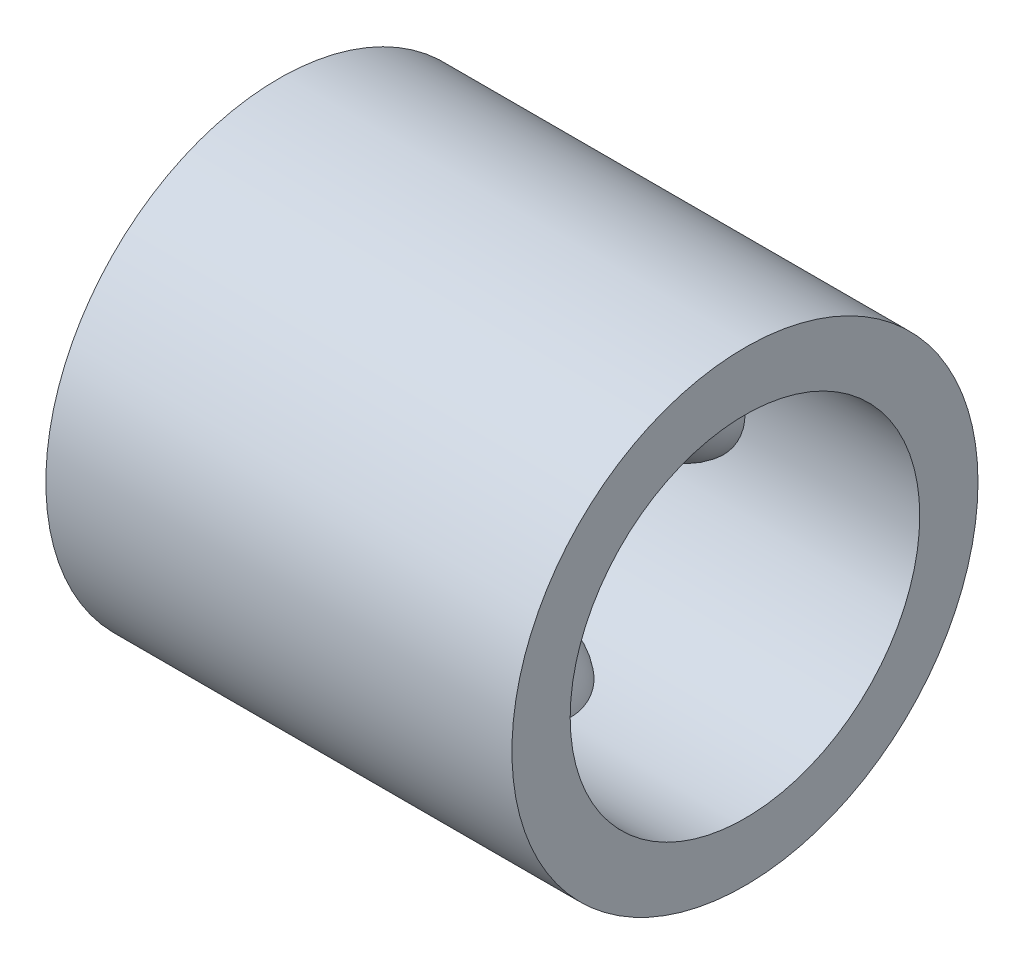
ISO-10303-21;
HEADER;
FILE_DESCRIPTION(('STEP AP214'),'2;1');
FILE_NAME('part.step','',(''),(''),'','','');
FILE_SCHEMA(('AUTOMOTIVE_DESIGN { 1 0 10303 214 1 1 1 1 }'));
ENDSEC;
DATA;
#1=APPLICATION_CONTEXT('core data for automotive mechanical design processes');
#2=APPLICATION_PROTOCOL_DEFINITION('international standard','automotive_design',2000,#1);
#3=PRODUCT_CONTEXT('',#1,'mechanical');
#4=PRODUCT('Part','Part','',(#3));
#5=PRODUCT_RELATED_PRODUCT_CATEGORY('part','',(#4));
#6=PRODUCT_DEFINITION_FORMATION('','',#4);
#7=PRODUCT_DEFINITION_CONTEXT('part definition',#1,'design');
#8=PRODUCT_DEFINITION('design','',#6,#7);
#9=PRODUCT_DEFINITION_SHAPE('','',#8);
#10=(LENGTH_UNIT() NAMED_UNIT(*) SI_UNIT(.MILLI.,.METRE.));
#11=(NAMED_UNIT(*) PLANE_ANGLE_UNIT() SI_UNIT($,.RADIAN.));
#12=(NAMED_UNIT(*) SI_UNIT($,.STERADIAN.) SOLID_ANGLE_UNIT());
#13=UNCERTAINTY_MEASURE_WITH_UNIT(LENGTH_MEASURE(1.E-05),#10,'distance_accuracy_value','');
#14=(GEOMETRIC_REPRESENTATION_CONTEXT(3) GLOBAL_UNCERTAINTY_ASSIGNED_CONTEXT((#13)) GLOBAL_UNIT_ASSIGNED_CONTEXT((#10,
#11,#12)) REPRESENTATION_CONTEXT('',''));
#15=CARTESIAN_POINT('',(0.,0.,0.));
#16=DIRECTION('',(0.,0.,1.));
#17=DIRECTION('',(1.,0.,0.));
#18=AXIS2_PLACEMENT_3D('',#15,#16,#17);
#19=CARTESIAN_POINT('',(3.,0.,0.));
#20=DIRECTION('',(-1.,0.,0.));
#21=DIRECTION('',(0.,0.,1.));
#22=AXIS2_PLACEMENT_3D('',#19,#20,#21);
#23=CYLINDRICAL_SURFACE('',#22,2.25);
#24=CARTESIAN_POINT('',(-0.514475453961807,2.18320390841012,-0.544169729315007));
#25=CARTESIAN_POINT('',(-0.483857231627168,2.1761902072911,-0.572310094441369));
#26=CARTESIAN_POINT('',(-0.450813327775773,2.16924991283592,-0.597833744538482));
#27=CARTESIAN_POINT('',(-0.380774390145702,2.15628679421965,-0.643025715138986));
#28=CARTESIAN_POINT('',(-0.343778953634256,2.15026406372702,-0.662693438042122));
#29=CARTESIAN_POINT('',(-0.266844975689494,2.13981010944048,-0.695711357899875));
#30=CARTESIAN_POINT('',(-0.226905638311693,2.13537931797646,-0.709059839022342));
#31=CARTESIAN_POINT('',(-0.145223717077277,2.12861619904622,-0.729113389079151));
#32=CARTESIAN_POINT('',(-0.103481307478905,2.12628366926657,-0.735819098512872));
#33=CARTESIAN_POINT('',(-0.0197141646853738,2.12399340156827,-0.742404435989499));
#34=CARTESIAN_POINT('',(0.0223060735039454,2.12401790787613,-0.74233510101298));
#35=CARTESIAN_POINT('',(0.1057305670577,2.12639448932343,-0.735499280158993));
#36=CARTESIAN_POINT('',(0.147134828336581,2.12874654209975,-0.728732858627332));
#37=CARTESIAN_POINT('',(0.227969113247706,2.13549627259527,-0.708706959526068));
#38=CARTESIAN_POINT('',(0.267407068336695,2.13988484443031,-0.69547637139618));
#39=CARTESIAN_POINT('',(0.343421166557742,2.15021709649336,-0.662840726508583));
#40=CARTESIAN_POINT('',(0.379997119418207,2.15616088000102,-0.643435259666465));
#41=CARTESIAN_POINT('',(0.449629769599129,2.16901329894139,-0.598687252225042));
#42=CARTESIAN_POINT('',(0.48265002859993,2.17593050422079,-0.573290451672591));
#43=CARTESIAN_POINT('',(0.543877718626474,2.18992285699697,-0.517271068549696));
#44=CARTESIAN_POINT('',(0.572084990068602,2.19699800972199,-0.486648312770231));
#45=CARTESIAN_POINT('',(0.622955896175885,2.21053726012287,-0.420893885574038));
#46=CARTESIAN_POINT('',(0.645610428947912,2.2170003440138,-0.385754953167662));
#47=CARTESIAN_POINT('',(0.684670902098911,2.22858158589341,-0.311956524235575));
#48=CARTESIAN_POINT('',(0.701077647244825,2.23369991707107,-0.273297481924685));
#49=CARTESIAN_POINT('',(0.7268821263319,2.24192710501993,-0.194424139022189));
#50=CARTESIAN_POINT('',(0.736421683028262,2.24507643419042,-0.154260491658911));
#51=CARTESIAN_POINT('',(0.748772387457628,2.24919120929505,-0.0728041449904459));
#52=CARTESIAN_POINT('',(0.751584590706671,2.25015699782355,-0.0315116238330233));
#53=CARTESIAN_POINT('',(0.750413559555535,2.24980526250114,0.0499669008304017));
#54=CARTESIAN_POINT('',(0.746592486531266,2.2485422138293,0.0901555850263528));
#55=CARTESIAN_POINT('',(0.732575819780321,2.24397286450379,0.16928279109688));
#56=CARTESIAN_POINT('',(0.722380358776834,2.24066660639245,0.208221338983201));
#57=CARTESIAN_POINT('',(0.695898711221334,2.23235691762788,0.283775158746051));
#58=CARTESIAN_POINT('',(0.679612028329649,2.22735334867336,0.320390241011872));
#59=CARTESIAN_POINT('',(0.641385127055321,2.21616577064354,0.390340254346888));
#60=CARTESIAN_POINT('',(0.619444261131622,2.20998162638478,0.4236748091115));
#61=CARTESIAN_POINT('',(0.569890423833992,2.19690961946458,0.486989887514105));
#62=CARTESIAN_POINT('',(0.542155020302811,2.19000852326509,0.516871848089479));
#63=CARTESIAN_POINT('',(0.482075887892009,2.17636144272173,0.571619457173987));
#64=CARTESIAN_POINT('',(0.449731554527286,2.16961547885926,0.596484446646162));
#65=CARTESIAN_POINT('',(0.380523740644164,2.15685802136129,0.641104897108603));
#66=CARTESIAN_POINT('',(0.343576946262503,2.15086580068845,0.660736819034802));
#67=CARTESIAN_POINT('',(0.266762204615628,2.1404644972055,0.693694529203856));
#68=CARTESIAN_POINT('',(0.226894274160553,2.13605540528588,0.707020353732855));
#69=CARTESIAN_POINT('',(0.145370073588033,2.12932213543557,0.727048833714005));
#70=CARTESIAN_POINT('',(0.103714365081812,2.12699730770693,0.73375355345261));
#71=CARTESIAN_POINT('',(0.0198039770435377,2.12469773678068,0.740386620773051));
#72=CARTESIAN_POINT('',(-0.0224506674294087,2.12472285659074,0.740315363366678));
#73=CARTESIAN_POINT('',(-0.105926569147837,2.12710796654301,0.733433144857918));
#74=CARTESIAN_POINT('',(-0.147153866444434,2.12944539359402,0.726687312972396));
#75=CARTESIAN_POINT('',(-0.227832370705416,2.13615780278291,0.706710529284008));
#76=CARTESIAN_POINT('',(-0.267283523246086,2.14053284730988,0.693479378908809));
#77=CARTESIAN_POINT('',(-0.343459051118068,2.15085209561958,0.660778817913344));
#78=CARTESIAN_POINT('',(-0.380173042792885,2.15680192025185,0.641287006865252));
#79=CARTESIAN_POINT('',(-0.44972387094788,2.16960563750987,0.596532707569719));
#80=CARTESIAN_POINT('',(-0.482560423479678,2.17645959626847,0.571269797096495));
#81=CARTESIAN_POINT('',(-0.543752182129761,2.19038372121967,0.515320959326244));
#82=CARTESIAN_POINT('',(-0.572064074543992,2.19745528396866,0.484587956184977));
#83=CARTESIAN_POINT('',(-0.623061383040388,2.21096660621594,0.418637618768502));
#84=CARTESIAN_POINT('',(-0.645747058314787,2.21740639481097,0.383420491184022));
#85=CARTESIAN_POINT('',(-0.68464844020338,2.22887308447836,0.309831964526335));
#86=CARTESIAN_POINT('',(-0.700927681512138,2.23391370593715,0.271496339352051));
#87=CARTESIAN_POINT('',(-0.726866713181036,2.24210545238323,0.192456778281599));
#88=CARTESIAN_POINT('',(-0.736527646244456,2.24525690353897,0.151753252539533));
#89=CARTESIAN_POINT('',(-0.748775461740738,2.24926105101613,0.0703043175939487));
#90=CARTESIAN_POINT('',(-0.751544807378986,2.25017303118791,0.0295892039111422));
#91=CARTESIAN_POINT('',(-0.75046112809102,2.24977245288563,-0.0517396092072579));
#92=CARTESIAN_POINT('',(-0.746608709272761,2.24846009801111,-0.0923533175839922));
#93=CARTESIAN_POINT('',(-0.73249574084281,2.24378415669825,-0.171733480479104));
#94=CARTESIAN_POINT('',(-0.722325966840066,2.24044964300326,-0.210517869596279));
#95=CARTESIAN_POINT('',(-0.695942650492098,2.23209895941017,-0.28577740475182));
#96=CARTESIAN_POINT('',(-0.679728987612475,2.22708275597402,-0.322252504718631));
#97=CARTESIAN_POINT('',(-0.641610778415956,2.21585687169717,-0.392091598761657));
#98=CARTESIAN_POINT('',(-0.619682860149768,2.20964231726382,-0.425442032650324));
#99=CARTESIAN_POINT('',(-0.570732820152052,2.19666423391209,-0.488047199953124));
#100=CARTESIAN_POINT('',(-0.543709821623349,2.18990061062034,-0.517301226916571));
#101=CARTESIAN_POINT('',(-0.514475453961807,2.18320390841012,-0.544169729315007));
#102=B_SPLINE_CURVE_WITH_KNOTS('',3,(#24,#25,#26,#27,#28,#29,#30,#31,#32,#33,#34,#35,#36,#37,
#38,#39,#40,#41,#42,#43,#44,#45,#46,#47,#48,#49,#50,#51,#52,#53,#54,#55,#56,#57,#58,#59,#60,#61,
#62,#63,#64,#65,#66,#67,#68,#69,#70,#71,#72,#73,#74,#75,#76,#77,#78,#79,#80,#81,#82,#83,#84,#85,
#86,#87,#88,#89,#90,#91,#92,#93,#94,#95,#96,#97,#98,#99,#100,#101),.UNSPECIFIED.,.T.,.F.,(4,2,2,
2,2,2,2,2,2,2,2,2,2,2,2,2,2,2,2,2,2,2,2,2,2,2,2,2,2,2,2,2,2,2,2,2,2,2,4),(0.,0.126375294112325,
0.252763480468869,0.379185964723026,0.505596258071001,0.631054365982607,0.756511268500674,
0.881412542229377,1.00632211260021,1.13240955727877,1.25850118181058,1.38479813032264,
1.51107880523151,1.63467021422507,1.7582422305594,1.87883570328985,1.99942666518831,
2.12002745551276,2.24064206369474,2.3641237614439,2.48762166939136,2.61381850014852,
2.74001460474311,2.86617135227577,2.99232074538983,3.11725121668004,3.24218551342385,
3.36757189561395,3.49296745427537,3.61949952559111,3.74602576666175,3.87126352024763,
3.99647964509103,4.1183434628539,4.24019612668693,4.36033711786141,4.48048050515819,
4.60112322319687,4.7217867212614),.UNSPECIFIED.);
#103=CARTESIAN_POINT('',(-0.514475453961807,2.18320390841012,-0.544169729315007));
#104=VERTEX_POINT('',#103);
#105=EDGE_CURVE('E47',#104,#104,#102,.T.);
#106=ORIENTED_EDGE('',*,*,#105,.F.);
#107=EDGE_LOOP('',(#106));
#108=FACE_BOUND('',#107,.T.);
#109=CARTESIAN_POINT('',(0.,0.739509972887508,-2.125));
#110=CARTESIAN_POINT('',(-0.0418371706315381,0.739509966019105,-2.12500000431577));
#111=CARTESIAN_POINT('',(-0.0836743875340047,0.736150146359343,-2.1261781814544));
#112=CARTESIAN_POINT('',(-0.166149676344008,0.722790287096492,-2.13075649219653));
#113=CARTESIAN_POINT('',(-0.206787700874341,0.712789985509806,-2.13415671346513));
#114=CARTESIAN_POINT('',(-0.285700392840389,0.686389739853428,-2.14279267803087));
#115=CARTESIAN_POINT('',(-0.323976057723693,0.66999251843164,-2.14802764033194));
#116=CARTESIAN_POINT('',(-0.397134833056352,0.631179929985015,-2.15975023940309));
#117=CARTESIAN_POINT('',(-0.432017733770347,0.608764191226587,-2.1662379535424));
#118=CARTESIAN_POINT('',(-0.497678783619839,0.558266206938434,-2.17979932833351));
#119=CARTESIAN_POINT('',(-0.528426708185485,0.530145648371433,-2.18687674919534));
#120=CARTESIAN_POINT('',(-0.584690944410479,0.469029554180578,-2.20079335185671));
#121=CARTESIAN_POINT('',(-0.610207312787381,0.436034071414551,-2.20763253623841));
#122=CARTESIAN_POINT('',(-0.655208568424211,0.366167341410911,-2.22028717022817));
#123=CARTESIAN_POINT('',(-0.674716916540663,0.329311942824073,-2.22610656263945));
#124=CARTESIAN_POINT('',(-0.707274528363552,0.252643083046293,-2.23610458756606));
#125=CARTESIAN_POINT('',(-0.720324795547407,0.212830082523476,-2.24028347496748));
#126=CARTESIAN_POINT('',(-0.739338019835766,0.132437324513902,-2.24645158079142));
#127=CARTESIAN_POINT('',(-0.745469493174582,0.0919014007760092,-2.24849277211633));
#128=CARTESIAN_POINT('',(-0.751042664384464,0.0103239324949375,-2.25034596487959));
#129=CARTESIAN_POINT('',(-0.750485240568959,-0.0307175449574183,-2.2501582589926));
#130=CARTESIAN_POINT('',(-0.742777019983859,-0.111280489325454,-2.24760086789779));
#131=CARTESIAN_POINT('',(-0.735757088026058,-0.150815960989175,-2.24527449173513));
#132=CARTESIAN_POINT('',(-0.715507422410703,-0.228098175622725,-2.23874425011262));
#133=CARTESIAN_POINT('',(-0.702277576804338,-0.265844886332276,-2.23454035080592));
#134=CARTESIAN_POINT('',(-0.669849639557223,-0.3388052128744,-2.22465221609146));
#135=CARTESIAN_POINT('',(-0.650608416685397,-0.373998182341165,-2.21895733239637));
#136=CARTESIAN_POINT('',(-0.606700107500377,-0.440647099811357,-2.20668985928605));
#137=CARTESIAN_POINT('',(-0.582032291612844,-0.47210254444937,-2.20011715189918));
#138=CARTESIAN_POINT('',(-0.527192264550854,-0.531285252553719,-2.18659159372553));
#139=CARTESIAN_POINT('',(-0.496893126732277,-0.558893698799539,-2.17963329801266));
#140=CARTESIAN_POINT('',(-0.432042573374848,-0.608721624588851,-2.16624687270803));
#141=CARTESIAN_POINT('',(-0.397490707833847,-0.630940533098443,-2.15981879934213));
#142=CARTESIAN_POINT('',(-0.32442687188633,-0.6698038108282,-2.14808838776009));
#143=CARTESIAN_POINT('',(-0.285857378082089,-0.686346565946613,-2.14280713516123));
#144=CARTESIAN_POINT('',(-0.206340262500953,-0.712930295108097,-2.13411047795531));
#145=CARTESIAN_POINT('',(-0.165392730295547,-0.722971513865985,-2.13069500312199));
#146=CARTESIAN_POINT('',(-0.0825037269152612,-0.736279939551203,-2.12613306358538));
#147=CARTESIAN_POINT('',(-0.0405684431727888,-0.739581684378479,-2.12497503150767));
#148=CARTESIAN_POINT('',(0.0432876641862948,-0.739435902271017,-2.12502579001178));
#149=CARTESIAN_POINT('',(0.0852084883378776,-0.735988659800096,-2.12623448083834));
#150=CARTESIAN_POINT('',(0.167509637061314,-0.722480203607325,-2.13086178222927));
#151=CARTESIAN_POINT('',(0.207899334338746,-0.712470094623093,-2.13426331384963));
#152=CARTESIAN_POINT('',(0.286352678807986,-0.686118340470936,-2.14287946980289));
#153=CARTESIAN_POINT('',(0.324416204648952,-0.669776365310447,-2.1480941886307));
#154=CARTESIAN_POINT('',(0.397441353115855,-0.630999716351527,-2.1598033938536));
#155=CARTESIAN_POINT('',(0.43237894935124,-0.608522472923302,-2.16630673155244));
#156=CARTESIAN_POINT('',(0.497902539145396,-0.55805759191544,-2.17985145165143));
#157=CARTESIAN_POINT('',(0.528488274733964,-0.530069627904771,-2.18689286590977));
#158=CARTESIAN_POINT('',(0.584654658525143,-0.469078145270145,-2.20078348265165));
#159=CARTESIAN_POINT('',(0.61020326891299,-0.436044753034304,-2.20763123154135));
#160=CARTESIAN_POINT('',(0.655341941546338,-0.365955866909575,-2.22032484398499));
#161=CARTESIAN_POINT('',(0.674932538649352,-0.328900734462269,-2.22617079745065));
#162=CARTESIAN_POINT('',(0.707324539809624,-0.252428766319439,-2.23612193609591));
#163=CARTESIAN_POINT('',(0.72023036666753,-0.21305967164359,-2.24025368144153));
#164=CARTESIAN_POINT('',(0.739345418462079,-0.132572826587885,-2.24645314839796));
#165=CARTESIAN_POINT('',(0.745555789005848,-0.0914553766072623,-2.2485212231028));
#166=CARTESIAN_POINT('',(0.751022308512595,-0.00980606783013249,-2.25033944166939));
#167=CARTESIAN_POINT('',(0.750457959234294,0.0307125361917834,-2.25014941710174));
#168=CARTESIAN_POINT('',(0.742825404044873,0.111061265620046,-2.24761671611889));
#169=CARTESIAN_POINT('',(0.735757587568383,0.150891432105282,-2.24527416859911));
#170=CARTESIAN_POINT('',(0.715394933362594,0.228449952835044,-2.2387084556585));
#171=CARTESIAN_POINT('',(0.702145360931979,0.266191390866625,-2.23449897158901));
#172=CARTESIAN_POINT('',(0.66979748174088,0.338873068769509,-2.22463737979475));
#173=CARTESIAN_POINT('',(0.650698668322434,0.373813065650614,-2.21898514710695));
#174=CARTESIAN_POINT('',(0.60672293979902,0.440660916019108,-2.20669362800509));
#175=CARTESIAN_POINT('',(0.581740003658554,0.472495823063799,-2.20003715037846));
#176=CARTESIAN_POINT('',(0.526864814769053,0.53155887263607,-2.18651892123088));
#177=CARTESIAN_POINT('',(0.496971831017608,0.558786327984105,-2.17965713926903));
#178=CARTESIAN_POINT('',(0.432239749482909,0.608617408819048,-2.16627993006041));
#179=CARTESIAN_POINT('',(0.397295421794057,0.631087969788498,-2.15977750233819));
#180=CARTESIAN_POINT('',(0.323998163577887,0.669987537906863,-2.14802965741675));
#181=CARTESIAN_POINT('',(0.285645211824527,0.686416507430557,-2.14278424804593));
#182=CARTESIAN_POINT('',(0.206670956338058,0.712820724653085,-2.13414632927724));
#183=CARTESIAN_POINT('',(0.166054657590748,0.722809642648206,-2.13074989745758));
#184=CARTESIAN_POINT('',(0.083625543998036,0.736154087729182,-2.12617679172238));
#185=CARTESIAN_POINT('',(0.0418127951075313,0.739509979751909,-2.12499999568674));
#186=CARTESIAN_POINT('',(0.,0.739509972887508,-2.125));
#187=B_SPLINE_CURVE_WITH_KNOTS('',3,(#109,#110,#111,#112,#113,#114,#115,#116,#117,#118,#119,
#120,#121,#122,#123,#124,#125,#126,#127,#128,#129,#130,#131,#132,#133,#134,#135,#136,#137,#138,
#139,#140,#141,#142,#143,#144,#145,#146,#147,#148,#149,#150,#151,#152,#153,#154,#155,#156,#157,
#158,#159,#160,#161,#162,#163,#164,#165,#166,#167,#168,#169,#170,#171,#172,#173,#174,#175,#176,
#177,#178,#179,#180,#181,#182,#183,#184,#185,#186),.UNSPECIFIED.,.T.,.F.,(4,2,2,2,2,2,2,2,2,2,2,
2,2,2,2,2,2,2,2,2,2,2,2,2,2,2,2,2,2,2,2,2,2,2,2,2,2,2,4),(0.,0.1253619905,0.250728927137501,
0.376042563389552,0.501363941416855,0.627556620169112,0.75374793073986,0.879440036132522,
1.00511260494373,1.12765332027824,1.25017794507114,1.37027477659391,1.49037377323759,
1.61135506760032,1.73235263715618,1.85651013413786,1.98068078015109,2.10697067522035,
2.23325581652009,2.35889214062404,2.4845231693826,2.60918735229326,2.73385803309675,
2.85941675342061,2.98498291353374,3.11132363163133,3.23765300463131,3.36194447684625,
3.48621467914346,3.60719967156724,3.72817741975061,3.84828289808141,3.96839878282494,
4.09087150035042,4.21336246803176,4.33892494924725,4.46448821241502,4.58978405719696,
4.71507300824036),.UNSPECIFIED.);
#188=CARTESIAN_POINT('',(0.,0.739509972887508,-2.125));
#189=VERTEX_POINT('',#188);
#190=EDGE_CURVE('E80',#189,#189,#187,.T.);
#191=ORIENTED_EDGE('',*,*,#190,.F.);
#192=EDGE_LOOP('',(#191));
#193=FACE_BOUND('',#192,.T.);
#194=CARTESIAN_POINT('',(3.,0.,0.));
#195=DIRECTION('',(1.,0.,0.));
#196=DIRECTION('',(0.,0.,-1.));
#197=AXIS2_PLACEMENT_3D('',#194,#195,#196);
#198=CIRCLE('',#197,2.25);
#199=CARTESIAN_POINT('',(3.,0.,-2.25));
#200=VERTEX_POINT('',#199);
#201=EDGE_CURVE('E123',#200,#200,#198,.T.);
#202=ORIENTED_EDGE('',*,*,#201,.T.);
#203=EDGE_LOOP('',(#202));
#204=FACE_BOUND('',#203,.T.);
#205=CARTESIAN_POINT('',(-3.,0.,0.));
#206=DIRECTION('',(1.,0.,0.));
#207=DIRECTION('',(0.,0.,-1.));
#208=AXIS2_PLACEMENT_3D('',#205,#206,#207);
#209=CIRCLE('',#208,2.25);
#210=CARTESIAN_POINT('',(-3.,0.,-2.25));
#211=VERTEX_POINT('',#210);
#212=EDGE_CURVE('E120',#211,#211,#209,.T.);
#213=ORIENTED_EDGE('',*,*,#212,.F.);
#214=EDGE_LOOP('',(#213));
#215=FACE_BOUND('',#214,.T.);
#216=DIRECTION('',(-1.,0.,0.));
#217=VECTOR('',#216,1.);
#218=CARTESIAN_POINT('',(3.,0.0734586080407039,2.2488005320403));
#219=LINE('',#218,#217);
#220=CARTESIAN_POINT('',(-0.747357423599524,0.0734586080407038,2.24880053204029));
#221=VERTEX_POINT('',#220);
#222=CARTESIAN_POINT('',(0.747357423599524,0.0734586080407038,2.24880053204029));
#223=VERTEX_POINT('',#222);
#224=EDGE_CURVE('E112',#221,#223,#219,.F.);
#225=ORIENTED_EDGE('',*,*,#224,.T.);
#226=CARTESIAN_POINT('',(-0.514398684503027,-0.543051733531788,2.18348226800863));
#227=CARTESIAN_POINT('',(-0.483783185887388,-0.571192955005356,2.1764836562346));
#228=CARTESIAN_POINT('',(-0.450742091667321,-0.596717547068843,2.16955719325324));
#229=CARTESIAN_POINT('',(-0.380708976034091,-0.64191114696204,2.1566188273322));
#230=CARTESIAN_POINT('',(-0.343716548577389,-0.66157955221519,2.15060701853764));
#231=CARTESIAN_POINT('',(-0.266788852834119,-0.694598209138778,2.14017168474279));
#232=CARTESIAN_POINT('',(-0.226852789396475,-0.707946746370001,2.13574859080386));
#233=CARTESIAN_POINT('',(-0.145177716627632,-0.727999530986332,2.12899739128722));
#234=CARTESIAN_POINT('',(-0.103438882081227,-0.734704420993333,2.1266690830886));
#235=CARTESIAN_POINT('',(-0.0196813752052072,-0.74128697634497,2.12438365615237));
#236=CARTESIAN_POINT('',(0.0223327736354555,-0.741216037431114,2.12440868694097));
#237=CARTESIAN_POINT('',(0.105744892028978,-0.734376787364873,2.12678241907275));
#238=CARTESIAN_POINT('',(0.147142867560311,-0.727608541236731,2.12913109785559));
#239=CARTESIAN_POINT('',(0.227964692602254,-0.707578914450053,2.13587030666006));
#240=CARTESIAN_POINT('',(0.267396469570934,-0.694346408826828,2.14025175223145));
#241=CARTESIAN_POINT('',(0.343398366486493,-0.66170708924228,2.15056622483903));
#242=CARTESIAN_POINT('',(0.37996829610715,-0.642299865067366,2.15649935495576));
#243=CARTESIAN_POINT('',(0.449589120339642,-0.597548828657383,2.16932718218161));
#244=CARTESIAN_POINT('',(0.482603583166405,-0.572150766393174,2.17623041831714));
#245=CARTESIAN_POINT('',(0.543820144262242,-0.516129713097277,2.19019209891658));
#246=CARTESIAN_POINT('',(0.572022083107632,-0.485506549041689,2.19725054851347));
#247=CARTESIAN_POINT('',(0.622882842679325,-0.41975257993329,2.21075420489947));
#248=CARTESIAN_POINT('',(0.645532576957213,-0.384614527377647,2.21719839603232));
#249=CARTESIAN_POINT('',(0.684584203728644,-0.310819339491882,2.22874039549734));
#250=CARTESIAN_POINT('',(0.7009869008697,-0.272162658172807,2.23383837720161));
#251=CARTESIAN_POINT('',(0.72678426852694,-0.193295489564008,2.24202460862378));
#252=CARTESIAN_POINT('',(0.736320725250111,-0.153135614669883,2.24515334050691));
#253=CARTESIAN_POINT('',(0.748666133844661,-0.0716883668322173,2.24922694801321));
#254=CARTESIAN_POINT('',(0.751476140685263,-0.0304011717238579,2.25017216609555));
#255=CARTESIAN_POINT('',(0.750301744324097,0.0510658453441903,2.24978049052408));
#256=CARTESIAN_POINT('',(0.746479414547634,0.0912483802520188,2.24849803341119));
#257=CARTESIAN_POINT('',(0.732461110028677,0.170362199782374,2.24389107534484));
#258=CARTESIAN_POINT('',(0.722265267570539,0.209293510356841,2.24056661677382));
#259=CARTESIAN_POINT('',(0.695783625346983,0.284832503162056,2.23222216462521));
#260=CARTESIAN_POINT('',(0.679497267966375,0.321439972275139,2.22720201580329));
#261=CARTESIAN_POINT('',(0.641271798629209,0.39137436994814,2.21598329591716));
#262=CARTESIAN_POINT('',(0.619332039054824,0.424700922062176,2.20978458986625));
#263=CARTESIAN_POINT('',(0.569781169398389,0.487999871195755,2.19668541505582));
#264=CARTESIAN_POINT('',(0.542047638201379,0.517873700028746,2.18977176692232));
#265=CARTESIAN_POINT('',(0.481972976551979,0.572605478257279,2.17610216199842));
#266=CARTESIAN_POINT('',(0.449631241921067,0.597462768903537,2.16934622602095));
#267=CARTESIAN_POINT('',(0.3804297607368,0.64206820837253,2.15657139777011));
#268=CARTESIAN_POINT('',(0.343486760232944,0.661692902780104,2.15057182737934));
#269=CARTESIAN_POINT('',(0.266680307210533,0.694637469600555,2.14015863766638));
#270=CARTESIAN_POINT('',(0.226816871832339,0.7079573790135,2.13574500903704));
#271=CARTESIAN_POINT('',(0.145302968385111,0.727975422647171,2.12900550985056));
#272=CARTESIAN_POINT('',(0.103653092293998,0.734675733002948,2.12667895321));
#273=CARTESIAN_POINT('',(0.0197548963698151,0.74130193240624,2.12437855472849));
#274=CARTESIAN_POINT('',(-0.0224933884026181,0.74122821671437,2.12440457561596));
#275=CARTESIAN_POINT('',(-0.10595594860769,0.734343131722615,2.12679398593542));
#276=CARTESIAN_POINT('',(-0.147176272368036,0.727596923918305,2.12913477006277));
#277=CARTESIAN_POINT('',(-0.227840697060373,0.707621410254324,2.13585624239905));
#278=CARTESIAN_POINT('',(-0.267284743521205,0.694391905726083,2.14023699311877));
#279=CARTESIAN_POINT('',(-0.343446335460178,0.661696418946021,2.15056997617571));
#280=CARTESIAN_POINT('',(-0.380153482222916,0.642208009768351,2.15652784594769));
#281=CARTESIAN_POINT('',(-0.449690913795552,0.597462063955714,2.16934988112844));
#282=CARTESIAN_POINT('',(-0.482520914471723,0.572204104901134,2.17621411288129));
#283=CARTESIAN_POINT('',(-0.543700339614976,0.516266137258691,2.19016110730748));
#284=CARTESIAN_POINT('',(-0.572006405428777,0.485539009877184,2.19724528772402));
#285=CARTESIAN_POINT('',(-0.622992665405154,0.419601147320961,2.21078389740338));
#286=CARTESIAN_POINT('',(-0.645673118444704,0.384390618574322,2.21723835563618));
#287=CARTESIAN_POINT('',(-0.684565032964776,0.310815201432528,2.22873612054069));
#288=CARTESIAN_POINT('',(-0.70083996833885,0.272486054031543,2.23379311745096));
#289=CARTESIAN_POINT('',(-0.726771135623141,0.193459304636151,2.24201909082461));
#290=CARTESIAN_POINT('',(-0.736428510017562,0.152762112788046,2.24518839317534));
#291=CARTESIAN_POINT('',(-0.748670151846211,0.0713250145203232,2.24922882899027));
#292=CARTESIAN_POINT('',(-0.751436827850201,0.030615410514898,2.25015920745907));
#293=CARTESIAN_POINT('',(-0.750348579846343,-0.0507030383859321,2.24979595757257));
#294=CARTESIAN_POINT('',(-0.746494261012957,-0.0913118921503983,2.24850253247812));
#295=CARTESIAN_POINT('',(-0.732378310388303,-0.170683206660808,2.24386419887035));
#296=CARTESIAN_POINT('',(-0.722207434395441,-0.209463589929355,2.24054836011606));
#297=CARTESIAN_POINT('',(-0.695822705267512,-0.284715803564501,2.23223452387639));
#298=CARTESIAN_POINT('',(-0.679608735455079,-0.321187589341821,2.22723649391218));
#299=CARTESIAN_POINT('',(-0.641494854974584,-0.391013084454263,2.21604722770341));
#300=CARTESIAN_POINT('',(-0.619572795268578,-0.424353943540432,2.20985136820168));
#301=CARTESIAN_POINT('',(-0.570637362876661,-0.486942333212404,2.19690924442415));
#302=CARTESIAN_POINT('',(-0.543623114110937,-0.51618915793373,2.19016288555175));
#303=CARTESIAN_POINT('',(-0.514398684503027,-0.543051733531788,2.18348226800863));
#304=B_SPLINE_CURVE_WITH_KNOTS('',3,(#226,#227,#228,#229,#230,#231,#232,#233,#234,#235,#236,
#237,#238,#239,#240,#241,#242,#243,#244,#245,#246,#247,#248,#249,#250,#251,#252,#253,#254,#255,
#256,#257,#258,#259,#260,#261,#262,#263,#264,#265,#266,#267,#268,#269,#270,#271,#272,#273,#274,
#275,#276,#277,#278,#279,#280,#281,#282,#283,#284,#285,#286,#287,#288,#289,#290,#291,#292,#293,
#294,#295,#296,#297,#298,#299,#300,#301,#302,#303),.UNSPECIFIED.,.T.,.F.,(4,2,2,2,2,2,2,2,2,2,2,
2,2,2,2,2,2,2,2,2,2,2,2,2,2,2,2,2,2,2,2,2,2,2,2,2,2,2,4),(0.,0.126363588208219,
0.252740174199076,0.379151023722808,0.505549644675549,0.6309895886639,0.756428314766141,
0.881311775647686,1.00620353481732,1.13227288403076,1.2583464087122,1.38462490155727,
1.51088712363831,1.6344608213065,1.75801513653755,1.87859253080836,1.99916742253872,
2.11975335616933,2.24035310950385,2.3638197628844,2.48730261881746,2.61348262313116,
2.73966188693953,2.86579965660681,2.99193006621076,3.11684076682708,3.24175529533883,
3.36712250756457,3.49249890153826,3.61901293041787,3.74552113635004,3.87074212074105,
3.99594148099197,4.11778959259697,4.23962656759128,4.35975225294186,4.47988025774589,
4.60048152647623,4.72110356288192),.UNSPECIFIED.);
#305=EDGE_CURVE('E106',#223,#221,#304,.T.);
#306=ORIENTED_EDGE('',*,*,#305,.T.);
#307=EDGE_LOOP('',(#225,#306));
#308=FACE_BOUND('',#307,.T.);
#309=DIRECTION('',(-1.,0.,0.));
#310=VECTOR('',#309,1.);
#311=CARTESIAN_POINT('',(3.,5.45633552445982E-12,2.25));
#312=LINE('',#311,#310);
#313=CARTESIAN_POINT('',(0.750959868720021,5.45632454318905E-12,2.25));
#314=VERTEX_POINT('',#313);
#315=CARTESIAN_POINT('',(-0.750959868720021,5.45633552445982E-12,2.25));
#316=VERTEX_POINT('',#315);
#317=EDGE_CURVE('E111',#314,#316,#312,.T.);
#318=ORIENTED_EDGE('',*,*,#317,.T.);
#319=EDGE_CURVE('E82',#316,#314,#304,.T.);
#320=ORIENTED_EDGE('',*,*,#319,.T.);
#321=EDGE_LOOP('',(#318,#320));
#322=FACE_BOUND('',#321,.T.);
#323=CARTESIAN_POINT('',(0.,-2.125,0.739509972887508));
#324=CARTESIAN_POINT('',(-0.0418371706315381,-2.12500000431577,0.739509966019104));
#325=CARTESIAN_POINT('',(-0.0836743875340047,-2.1261781814544,0.736150146359343));
#326=CARTESIAN_POINT('',(-0.166149676344008,-2.13075649219653,0.722790287096492));
#327=CARTESIAN_POINT('',(-0.206787700874341,-2.13415671346513,0.712789985509806));
#328=CARTESIAN_POINT('',(-0.285700392840389,-2.14279267803087,0.686389739853427));
#329=CARTESIAN_POINT('',(-0.323976057723693,-2.14802764033194,0.669992518431639));
#330=CARTESIAN_POINT('',(-0.397134833056352,-2.15975023940309,0.631179929985015));
#331=CARTESIAN_POINT('',(-0.432017733770347,-2.1662379535424,0.608764191226586));
#332=CARTESIAN_POINT('',(-0.497678783619839,-2.17979932833351,0.558266206938434));
#333=CARTESIAN_POINT('',(-0.528426708185484,-2.18687674919534,0.530145648371433));
#334=CARTESIAN_POINT('',(-0.584690944410479,-2.20079335185671,0.469029554180578));
#335=CARTESIAN_POINT('',(-0.610207312787381,-2.20763253623841,0.43603407141455));
#336=CARTESIAN_POINT('',(-0.655208568424211,-2.22028717022817,0.366167341410911));
#337=CARTESIAN_POINT('',(-0.674716916540663,-2.22610656263945,0.329311942824073));
#338=CARTESIAN_POINT('',(-0.707274528363551,-2.23610458756606,0.252643083046293));
#339=CARTESIAN_POINT('',(-0.720324795547407,-2.24028347496748,0.212830082523476));
#340=CARTESIAN_POINT('',(-0.739338019835766,-2.24645158079142,0.132437324513902));
#341=CARTESIAN_POINT('',(-0.745469493174582,-2.24849277211633,0.0919014007760089));
#342=CARTESIAN_POINT('',(-0.751042664384464,-2.25034596487959,0.0103239324949372));
#343=CARTESIAN_POINT('',(-0.750485240568958,-2.2501582589926,-0.0307175449574187));
#344=CARTESIAN_POINT('',(-0.742777019983859,-2.24760086789779,-0.111280489325454));
#345=CARTESIAN_POINT('',(-0.735757088026058,-2.24527449173513,-0.150815960989176));
#346=CARTESIAN_POINT('',(-0.715507422410703,-2.23874425011262,-0.228098175622726));
#347=CARTESIAN_POINT('',(-0.702277576804337,-2.23454035080592,-0.265844886332276));
#348=CARTESIAN_POINT('',(-0.669849639557222,-2.22465221609146,-0.3388052128744));
#349=CARTESIAN_POINT('',(-0.650608416685397,-2.21895733239637,-0.373998182341166));
#350=CARTESIAN_POINT('',(-0.606700107500377,-2.20668985928605,-0.440647099811357));
#351=CARTESIAN_POINT('',(-0.582032291612844,-2.20011715189918,-0.47210254444937));
#352=CARTESIAN_POINT('',(-0.527192264550854,-2.18659159372553,-0.531285252553719));
#353=CARTESIAN_POINT('',(-0.496893126732277,-2.17963329801266,-0.558893698799539));
#354=CARTESIAN_POINT('',(-0.432042573374847,-2.16624687270803,-0.608721624588851));
#355=CARTESIAN_POINT('',(-0.397490707833846,-2.15981879934213,-0.630940533098443));
#356=CARTESIAN_POINT('',(-0.32442687188633,-2.14808838776009,-0.6698038108282));
#357=CARTESIAN_POINT('',(-0.285857378082088,-2.14280713516123,-0.686346565946613));
#358=CARTESIAN_POINT('',(-0.206340262500952,-2.13411047795531,-0.712930295108097));
#359=CARTESIAN_POINT('',(-0.165392730295546,-2.13069500312199,-0.722971513865985));
#360=CARTESIAN_POINT('',(-0.0825037269152605,-2.12613306358538,-0.736279939551203));
#361=CARTESIAN_POINT('',(-0.0405684431727883,-2.12497503150767,-0.739581684378479));
#362=CARTESIAN_POINT('',(0.0432876641862952,-2.12502579001178,-0.739435902271017));
#363=CARTESIAN_POINT('',(0.0852084883378781,-2.12623448083834,-0.735988659800095));
#364=CARTESIAN_POINT('',(0.167509637061315,-2.13086178222927,-0.722480203607325));
#365=CARTESIAN_POINT('',(0.207899334338746,-2.13426331384963,-0.712470094623093));
#366=CARTESIAN_POINT('',(0.286352678807987,-2.14287946980289,-0.686118340470935));
#367=CARTESIAN_POINT('',(0.324416204648952,-2.1480941886307,-0.669776365310446));
#368=CARTESIAN_POINT('',(0.397441353115856,-2.1598033938536,-0.630999716351526));
#369=CARTESIAN_POINT('',(0.432378949351241,-2.16630673155244,-0.608522472923301));
#370=CARTESIAN_POINT('',(0.497902539145397,-2.17985145165143,-0.558057591915439));
#371=CARTESIAN_POINT('',(0.528488274733964,-2.18689286590977,-0.53006962790477));
#372=CARTESIAN_POINT('',(0.584654658525143,-2.20078348265165,-0.469078145270144));
#373=CARTESIAN_POINT('',(0.61020326891299,-2.20763123154135,-0.436044753034303));
#374=CARTESIAN_POINT('',(0.655341941546338,-2.22032484398499,-0.365955866909574));
#375=CARTESIAN_POINT('',(0.674932538649352,-2.22617079745065,-0.328900734462268));
#376=CARTESIAN_POINT('',(0.707324539809624,-2.23612193609591,-0.252428766319438));
#377=CARTESIAN_POINT('',(0.720230366667529,-2.24025368144153,-0.213059671643589));
#378=CARTESIAN_POINT('',(0.739345418462079,-2.24645314839796,-0.132572826587884));
#379=CARTESIAN_POINT('',(0.745555789005847,-2.2485212231028,-0.0914553766072616));
#380=CARTESIAN_POINT('',(0.751022308512595,-2.25033944166939,-0.00980606783013175));
#381=CARTESIAN_POINT('',(0.750457959234294,-2.25014941710174,0.0307125361917841));
#382=CARTESIAN_POINT('',(0.742825404044873,-2.24761671611889,0.111061265620047));
#383=CARTESIAN_POINT('',(0.735757587568383,-2.24527416859911,0.150891432105282));
#384=CARTESIAN_POINT('',(0.715394933362593,-2.2387084556585,0.228449952835044));
#385=CARTESIAN_POINT('',(0.702145360931978,-2.23449897158901,0.266191390866626));
#386=CARTESIAN_POINT('',(0.669797481740879,-2.22463737979475,0.338873068769509));
#387=CARTESIAN_POINT('',(0.650698668322434,-2.21898514710695,0.373813065650615));
#388=CARTESIAN_POINT('',(0.60672293979902,-2.20669362800509,0.440660916019109));
#389=CARTESIAN_POINT('',(0.581740003658554,-2.20003715037846,0.472495823063799));
#390=CARTESIAN_POINT('',(0.526864814769052,-2.18651892123088,0.531558872636071));
#391=CARTESIAN_POINT('',(0.496971831017607,-2.17965713926903,0.558786327984105));
#392=CARTESIAN_POINT('',(0.432239749482908,-2.16627993006041,0.608617408819049));
#393=CARTESIAN_POINT('',(0.397295421794056,-2.15977750233819,0.631087969788498));
#394=CARTESIAN_POINT('',(0.323998163577887,-2.14802965741675,0.669987537906863));
#395=CARTESIAN_POINT('',(0.285645211824526,-2.14278424804593,0.686416507430557));
#396=CARTESIAN_POINT('',(0.206670956338057,-2.13414632927724,0.712820724653085));
#397=CARTESIAN_POINT('',(0.166054657590747,-2.13074989745758,0.722809642648206));
#398=CARTESIAN_POINT('',(0.0836255439980352,-2.12617679172238,0.736154087729181));
#399=CARTESIAN_POINT('',(0.041812795107531,-2.12499999568674,0.739509979751909));
#400=CARTESIAN_POINT('',(0.,-2.125,0.739509972887508));
#401=B_SPLINE_CURVE_WITH_KNOTS('',3,(#323,#324,#325,#326,#327,#328,#329,#330,#331,#332,#333,
#334,#335,#336,#337,#338,#339,#340,#341,#342,#343,#344,#345,#346,#347,#348,#349,#350,#351,#352,
#353,#354,#355,#356,#357,#358,#359,#360,#361,#362,#363,#364,#365,#366,#367,#368,#369,#370,#371,
#372,#373,#374,#375,#376,#377,#378,#379,#380,#381,#382,#383,#384,#385,#386,#387,#388,#389,#390,
#391,#392,#393,#394,#395,#396,#397,#398,#399,#400),.UNSPECIFIED.,.T.,.F.,(4,2,2,2,2,2,2,2,2,2,2,
2,2,2,2,2,2,2,2,2,2,2,2,2,2,2,2,2,2,2,2,2,2,2,2,2,2,2,4),(0.,0.125361990500001,
0.250728927137501,0.376042563389552,0.501363941416855,0.627556620169112,0.75374793073986,
0.879440036132522,1.00511260494373,1.12765332027824,1.25017794507114,1.37027477659391,
1.49037377323759,1.61135506760032,1.73235263715618,1.85651013413786,1.98068078015109,
2.10697067522035,2.23325581652009,2.35889214062404,2.4845231693826,2.60918735229326,
2.73385803309675,2.85941675342061,2.98498291353374,3.11132363163133,3.23765300463131,
3.36194447684625,3.48621467914346,3.60719967156724,3.72817741975061,3.84828289808141,
3.96839878282493,4.09087150035042,4.21336246803176,4.33892494924725,4.46448821241502,
4.58978405719696,4.71507300824035),.UNSPECIFIED.);
#402=CARTESIAN_POINT('',(0.,-2.125,0.739509972887508));
#403=VERTEX_POINT('',#402);
#404=EDGE_CURVE('E11',#403,#403,#401,.T.);
#405=ORIENTED_EDGE('',*,*,#404,.T.);
#406=EDGE_LOOP('',(#405));
#407=FACE_BOUND('',#406,.T.);
#408=ADVANCED_FACE('F35',(#108,#193,#204,#215,#308,#322,#407),#23,.F.);
#409=CARTESIAN_POINT('',(3.,0.,0.));
#410=DIRECTION('',(1.,0.,0.));
#411=DIRECTION('',(0.,0.,-1.));
#412=AXIS2_PLACEMENT_3D('',#409,#410,#411);
#413=PLANE('',#412);
#414=CARTESIAN_POINT('',(3.,0.,0.));
#415=DIRECTION('',(1.,0.,0.));
#416=DIRECTION('',(0.,0.,-1.));
#417=AXIS2_PLACEMENT_3D('',#414,#415,#416);
#418=CIRCLE('',#417,3.);
#419=CARTESIAN_POINT('',(3.,0.,-3.));
#420=VERTEX_POINT('',#419);
#421=EDGE_CURVE('E129',#420,#420,#418,.T.);
#422=ORIENTED_EDGE('',*,*,#421,.T.);
#423=EDGE_LOOP('',(#422));
#424=FACE_BOUND('',#423,.T.);
#425=ORIENTED_EDGE('',*,*,#201,.F.);
#426=EDGE_LOOP('',(#425));
#427=FACE_BOUND('',#426,.T.);
#428=ADVANCED_FACE('F138',(#424,#427),#413,.T.);
#429=CARTESIAN_POINT('',(-3.,0.,0.));
#430=DIRECTION('',(1.,0.,0.));
#431=DIRECTION('',(0.,0.,-1.));
#432=AXIS2_PLACEMENT_3D('',#429,#430,#431);
#433=PLANE('',#432);
#434=CARTESIAN_POINT('',(-3.,0.,0.));
#435=DIRECTION('',(1.,0.,0.));
#436=DIRECTION('',(0.,0.,-1.));
#437=AXIS2_PLACEMENT_3D('',#434,#435,#436);
#438=CIRCLE('',#437,3.);
#439=CARTESIAN_POINT('',(-3.,0.,-3.));
#440=VERTEX_POINT('',#439);
#441=EDGE_CURVE('E127',#440,#440,#438,.T.);
#442=ORIENTED_EDGE('',*,*,#441,.F.);
#443=EDGE_LOOP('',(#442));
#444=FACE_BOUND('',#443,.T.);
#445=ORIENTED_EDGE('',*,*,#212,.T.);
#446=EDGE_LOOP('',(#445));
#447=FACE_BOUND('',#446,.T.);
#448=ADVANCED_FACE('F135',(#444,#447),#433,.F.);
#449=CARTESIAN_POINT('',(3.,0.,0.));
#450=DIRECTION('',(-1.,0.,0.));
#451=DIRECTION('',(0.,0.,1.));
#452=AXIS2_PLACEMENT_3D('',#449,#450,#451);
#453=CYLINDRICAL_SURFACE('',#452,3.);
#454=ORIENTED_EDGE('',*,*,#421,.F.);
#455=EDGE_LOOP('',(#454));
#456=FACE_BOUND('',#455,.T.);
#457=ORIENTED_EDGE('',*,*,#441,.T.);
#458=EDGE_LOOP('',(#457));
#459=FACE_BOUND('',#458,.T.);
#460=ADVANCED_FACE('F37',(#456,#459),#453,.T.);
#461=CARTESIAN_POINT('',(0.,-0.000959996835198762,2.25));
#462=DIRECTION('',(-1.,0.,0.));
#463=DIRECTION('',(0.,-0.999866716900043,0.0163263111427283));
#464=AXIS2_PLACEMENT_3D('',#461,#462,#463);
#465=CIRCLE('',#464,0.75);
#466=TRIMMED_CURVE('',#465,(PARAMETER_VALUE(-1.57207615232266)),
(PARAMETER_VALUE(1.57207615232266)),.T.,.PARAMETER.);
#467=CARTESIAN_POINT('',(0.,-2.55885712130012E-07,2.24998432888195));
#468=DIRECTION('',(0.,0.0163263111427283,0.999866716900043));
#469=AXIS1_PLACEMENT('',#467,#468);
#470=SURFACE_OF_REVOLUTION('',#466,#469);
#471=ORIENTED_EDGE('',*,*,#305,.F.);
#472=CARTESIAN_POINT('',(0.,0.,2.25000000000009));
#473=DIRECTION('',(0.,0.0163263111427283,0.999866716900043));
#474=DIRECTION('',(0.,-0.999866716900043,0.0163263111427283));
#475=AXIS2_PLACEMENT_3D('',#472,#473,#474);
#476=CIRCLE('',#475,0.750959868720021);
#477=EDGE_CURVE('E59',#314,#223,#476,.T.);
#478=ORIENTED_EDGE('',*,*,#477,.F.);
#479=ORIENTED_EDGE('',*,*,#319,.F.);
#480=EDGE_CURVE('E54',#221,#316,#476,.T.);
#481=ORIENTED_EDGE('',*,*,#480,.F.);
#482=EDGE_LOOP('',(#471,#478,#479,#481));
#483=FACE_BOUND('',#482,.T.);
#484=CARTESIAN_POINT('',(0.,-0.0122449792146085,1.50008490535748));
#485=VERTEX_POINT('',#484);
#486=VERTEX_LOOP('',#485);
#487=FACE_BOUND('',#486,.T.);
#488=ADVANCED_FACE('F101',(#483,#487),#470,.T.);
#489=CARTESIAN_POINT('',(0.,0.,2.25000000000009));
#490=DIRECTION('',(0.,-0.0163263111427283,-0.999866716900043));
#491=DIRECTION('',(0.,0.999866716900043,-0.0163263111427283));
#492=AXIS2_PLACEMENT_3D('',#489,#490,#491);
#493=PLANE('',#492);
#494=ORIENTED_EDGE('',*,*,#317,.F.);
#495=ORIENTED_EDGE('',*,*,#477,.T.);
#496=ORIENTED_EDGE('',*,*,#224,.F.);
#497=ORIENTED_EDGE('',*,*,#480,.T.);
#498=EDGE_LOOP('',(#494,#495,#496,#497));
#499=FACE_BOUND('',#498,.T.);
#500=ADVANCED_FACE('F98',(#499),#493,.F.);
#501=CARTESIAN_POINT('',(0.,0.,-2.25));
#502=DIRECTION('',(0.,0.,-1.));
#503=DIRECTION('',(0.,1.,0.));
#504=AXIS2_PLACEMENT_3D('',#501,#502,#503);
#505=SPHERICAL_SURFACE('',#504,0.75);
#506=ORIENTED_EDGE('',*,*,#190,.T.);
#507=EDGE_LOOP('',(#506));
#508=FACE_BOUND('',#507,.T.);
#509=ADVANCED_FACE('F75',(#508),#505,.T.);
#510=CARTESIAN_POINT('',(0.,2.24999584976037,0.));
#511=DIRECTION('',(-1.,0.,0.));
#512=DIRECTION('',(0.,0.00143162399723065,0.99999897522584));
#513=AXIS2_PLACEMENT_3D('',#510,#511,#512);
#514=CIRCLE('',#513,0.749995849760368);
#515=TRIMMED_CURVE('',#514,(PARAMETER_VALUE(-1.57222795128116)),
(PARAMETER_VALUE(1.57222795128116)),.T.,.PARAMETER.);
#516=CARTESIAN_POINT('',(0.,2.24999431260842,-0.00107371095602797));
#517=DIRECTION('',(0.,0.99999897522584,-0.00143162399723065));
#518=AXIS1_PLACEMENT('',#516,#517);
#519=SURFACE_OF_REVOLUTION('',#515,#518);
#520=CARTESIAN_POINT('',(0.,1.5,0.));
#521=VERTEX_POINT('',#520);
#522=VERTEX_LOOP('',#521);
#523=FACE_BOUND('',#522,.T.);
#524=ORIENTED_EDGE('',*,*,#105,.T.);
#525=EDGE_LOOP('',(#524));
#526=FACE_BOUND('',#525,.T.);
#527=ADVANCED_FACE('F71',(#523,#526),#519,.T.);
#528=CARTESIAN_POINT('',(0.,-2.25,0.));
#529=DIRECTION('',(0.,1.,0.));
#530=DIRECTION('',(0.,0.,-1.));
#531=AXIS2_PLACEMENT_3D('',#528,#529,#530);
#532=SPHERICAL_SURFACE('',#531,0.75);
#533=ORIENTED_EDGE('',*,*,#404,.F.);
#534=EDGE_LOOP('',(#533));
#535=FACE_BOUND('',#534,.T.);
#536=ADVANCED_FACE('F74',(#535),#532,.T.);
#537=CLOSED_SHELL('',(#408,#428,#448,#460,#488,#500,#509,#527,#536));
#538=MANIFOLD_SOLID_BREP('B2',#537);
#539=ADVANCED_BREP_SHAPE_REPRESENTATION('',(#18,#538),#14);
#540=SHAPE_DEFINITION_REPRESENTATION(#9,#539);
ENDSEC;
END-ISO-10303-21;
